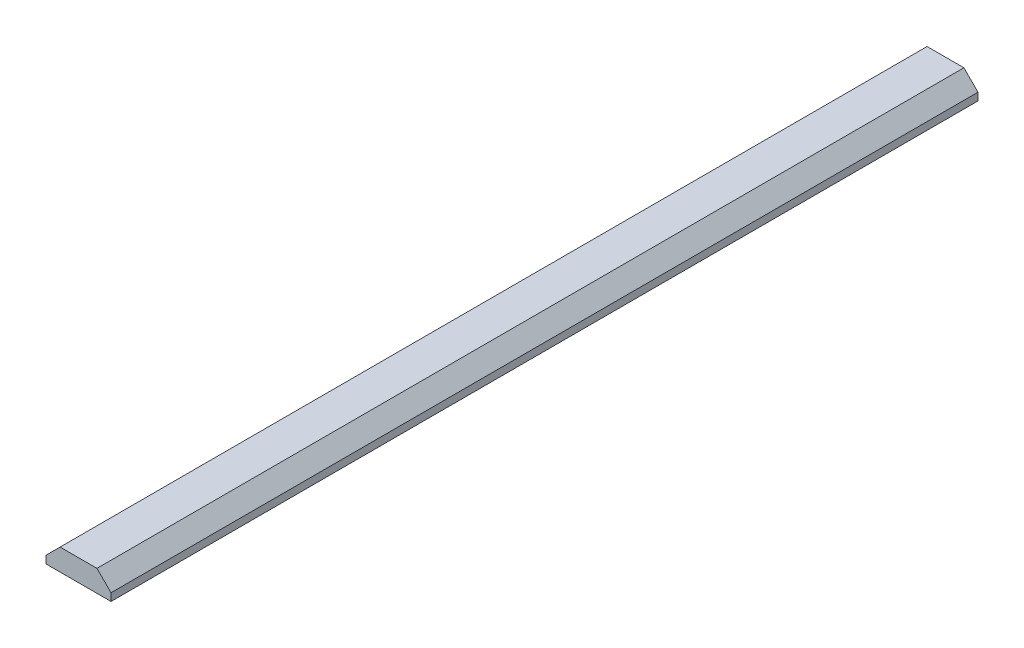
ISO-10303-21;
HEADER;
FILE_DESCRIPTION(('STEP AP214'),'2;1');
FILE_NAME('part.step','',(''),(''),'','','');
FILE_SCHEMA(('AUTOMOTIVE_DESIGN { 1 0 10303 214 1 1 1 1 }'));
ENDSEC;
DATA;
#1=APPLICATION_CONTEXT('core data for automotive mechanical design processes');
#2=APPLICATION_PROTOCOL_DEFINITION('international standard','automotive_design',2000,#1);
#3=PRODUCT_CONTEXT('',#1,'mechanical');
#4=PRODUCT('Part','Part','',(#3));
#5=PRODUCT_RELATED_PRODUCT_CATEGORY('part','',(#4));
#6=PRODUCT_DEFINITION_FORMATION('','',#4);
#7=PRODUCT_DEFINITION_CONTEXT('part definition',#1,'design');
#8=PRODUCT_DEFINITION('design','',#6,#7);
#9=PRODUCT_DEFINITION_SHAPE('','',#8);
#10=(LENGTH_UNIT() NAMED_UNIT(*) SI_UNIT(.MILLI.,.METRE.));
#11=(NAMED_UNIT(*) PLANE_ANGLE_UNIT() SI_UNIT($,.RADIAN.));
#12=(NAMED_UNIT(*) SI_UNIT($,.STERADIAN.) SOLID_ANGLE_UNIT());
#13=UNCERTAINTY_MEASURE_WITH_UNIT(LENGTH_MEASURE(1.E-05),#10,'distance_accuracy_value','');
#14=(GEOMETRIC_REPRESENTATION_CONTEXT(3) GLOBAL_UNCERTAINTY_ASSIGNED_CONTEXT((#13)) GLOBAL_UNIT_ASSIGNED_CONTEXT((#10,
#11,#12)) REPRESENTATION_CONTEXT('',''));
#15=CARTESIAN_POINT('',(0.,0.,0.));
#16=DIRECTION('',(0.,0.,1.));
#17=DIRECTION('',(1.,0.,0.));
#18=AXIS2_PLACEMENT_3D('',#15,#16,#17);
#19=CARTESIAN_POINT('',(3.4,1.80885878693797,160.));
#20=DIRECTION('',(0.707106781186549,0.707106781186546,0.));
#21=DIRECTION('',(-0.707106781186546,0.707106781186549,0.));
#22=AXIS2_PLACEMENT_3D('',#19,#20,#21);
#23=PLANE('',#22);
#24=DIRECTION('',(0.707106781186546,-0.707106781186549,0.));
#25=VECTOR('',#24,1.);
#26=CARTESIAN_POINT('',(3.4,1.80885878693797,0.));
#27=LINE('',#26,#25);
#28=CARTESIAN_POINT('',(3.4,1.80885878693797,0.));
#29=VERTEX_POINT('',#28);
#30=CARTESIAN_POINT('',(6.,-0.791141213062042,0.));
#31=VERTEX_POINT('',#30);
#32=EDGE_CURVE('E127',#29,#31,#27,.T.);
#33=ORIENTED_EDGE('',*,*,#32,.F.);
#34=DIRECTION('',(0.,0.,-1.));
#35=VECTOR('',#34,1.);
#36=CARTESIAN_POINT('',(3.4,1.80885878693797,160.));
#37=LINE('',#36,#35);
#38=CARTESIAN_POINT('',(3.4,1.80885878693797,160.));
#39=VERTEX_POINT('',#38);
#40=EDGE_CURVE('E11',#39,#29,#37,.T.);
#41=ORIENTED_EDGE('',*,*,#40,.F.);
#42=DIRECTION('',(0.707106781186546,-0.707106781186549,0.));
#43=VECTOR('',#42,1.);
#44=CARTESIAN_POINT('',(3.4,1.80885878693797,160.));
#45=LINE('',#44,#43);
#46=CARTESIAN_POINT('',(6.,-0.791141213062042,160.));
#47=VERTEX_POINT('',#46);
#48=EDGE_CURVE('E139',#39,#47,#45,.T.);
#49=ORIENTED_EDGE('',*,*,#48,.T.);
#50=DIRECTION('',(0.,0.,-1.));
#51=VECTOR('',#50,1.);
#52=CARTESIAN_POINT('',(6.,-0.791141213062042,160.));
#53=LINE('',#52,#51);
#54=EDGE_CURVE('E44',#47,#31,#53,.T.);
#55=ORIENTED_EDGE('',*,*,#54,.T.);
#56=EDGE_LOOP('',(#33,#41,#49,#55));
#57=FACE_BOUND('',#56,.T.);
#58=ADVANCED_FACE('F41',(#57),#23,.T.);
#59=CARTESIAN_POINT('',(3.4,1.80885878693797,160.));
#60=DIRECTION('',(0.,-1.,0.));
#61=DIRECTION('',(0.,0.,-1.));
#62=AXIS2_PLACEMENT_3D('',#59,#60,#61);
#63=PLANE('',#62);
#64=DIRECTION('',(-1.,0.,0.));
#65=VECTOR('',#64,1.);
#66=CARTESIAN_POINT('',(3.4,1.80885878693797,0.));
#67=LINE('',#66,#65);
#68=CARTESIAN_POINT('',(-3.4,1.80885878693797,0.));
#69=VERTEX_POINT('',#68);
#70=EDGE_CURVE('E80',#29,#69,#67,.T.);
#71=ORIENTED_EDGE('',*,*,#70,.T.);
#72=DIRECTION('',(0.,0.,-1.));
#73=VECTOR('',#72,1.);
#74=CARTESIAN_POINT('',(-3.4,1.80885878693797,160.));
#75=LINE('',#74,#73);
#76=CARTESIAN_POINT('',(-3.4,1.80885878693797,160.));
#77=VERTEX_POINT('',#76);
#78=EDGE_CURVE('E50',#77,#69,#75,.T.);
#79=ORIENTED_EDGE('',*,*,#78,.F.);
#80=DIRECTION('',(-1.,0.,0.));
#81=VECTOR('',#80,1.);
#82=CARTESIAN_POINT('',(3.4,1.80885878693797,160.));
#83=LINE('',#82,#81);
#84=EDGE_CURVE('E105',#39,#77,#83,.T.);
#85=ORIENTED_EDGE('',*,*,#84,.F.);
#86=ORIENTED_EDGE('',*,*,#40,.T.);
#87=EDGE_LOOP('',(#71,#79,#85,#86));
#88=FACE_BOUND('',#87,.T.);
#89=ADVANCED_FACE('F159',(#88),#63,.F.);
#90=CARTESIAN_POINT('',(-3.4,1.80885878693797,160.));
#91=DIRECTION('',(0.707106781186549,-0.707106781186546,0.));
#92=DIRECTION('',(0.707106781186546,0.707106781186549,0.));
#93=AXIS2_PLACEMENT_3D('',#90,#91,#92);
#94=PLANE('',#93);
#95=DIRECTION('',(-0.707106781186546,-0.707106781186549,0.));
#96=VECTOR('',#95,1.);
#97=CARTESIAN_POINT('',(-3.4,1.80885878693797,0.));
#98=LINE('',#97,#96);
#99=CARTESIAN_POINT('',(-6.,-0.791141213062042,0.));
#100=VERTEX_POINT('',#99);
#101=EDGE_CURVE('E112',#69,#100,#98,.T.);
#102=ORIENTED_EDGE('',*,*,#101,.T.);
#103=DIRECTION('',(0.,0.,-1.));
#104=VECTOR('',#103,1.);
#105=CARTESIAN_POINT('',(-6.,-0.791141213062042,160.));
#106=LINE('',#105,#104);
#107=CARTESIAN_POINT('',(-6.,-0.791141213062042,160.));
#108=VERTEX_POINT('',#107);
#109=EDGE_CURVE('E109',#108,#100,#106,.T.);
#110=ORIENTED_EDGE('',*,*,#109,.F.);
#111=DIRECTION('',(-0.707106781186546,-0.707106781186549,0.));
#112=VECTOR('',#111,1.);
#113=CARTESIAN_POINT('',(-3.4,1.80885878693797,160.));
#114=LINE('',#113,#112);
#115=EDGE_CURVE('E98',#77,#108,#114,.T.);
#116=ORIENTED_EDGE('',*,*,#115,.F.);
#117=ORIENTED_EDGE('',*,*,#78,.T.);
#118=EDGE_LOOP('',(#102,#110,#116,#117));
#119=FACE_BOUND('',#118,.T.);
#120=ADVANCED_FACE('F110',(#119),#94,.F.);
#121=CARTESIAN_POINT('',(-6.,-0.791141213062042,160.));
#122=DIRECTION('',(1.,0.,0.));
#123=DIRECTION('',(0.,0.,-1.));
#124=AXIS2_PLACEMENT_3D('',#121,#122,#123);
#125=PLANE('',#124);
#126=DIRECTION('',(0.,-1.,0.));
#127=VECTOR('',#126,1.);
#128=CARTESIAN_POINT('',(-6.,-0.791141213062042,0.));
#129=LINE('',#128,#127);
#130=CARTESIAN_POINT('',(-6.,-2.19114121306203,0.));
#131=VERTEX_POINT('',#130);
#132=EDGE_CURVE('E136',#100,#131,#129,.T.);
#133=ORIENTED_EDGE('',*,*,#132,.T.);
#134=DIRECTION('',(0.,0.,-1.));
#135=VECTOR('',#134,1.);
#136=CARTESIAN_POINT('',(-6.,-2.19114121306203,160.));
#137=LINE('',#136,#135);
#138=CARTESIAN_POINT('',(-6.,-2.19114121306203,160.));
#139=VERTEX_POINT('',#138);
#140=EDGE_CURVE('E115',#139,#131,#137,.T.);
#141=ORIENTED_EDGE('',*,*,#140,.F.);
#142=DIRECTION('',(0.,-1.,0.));
#143=VECTOR('',#142,1.);
#144=CARTESIAN_POINT('',(-6.,-0.791141213062042,160.));
#145=LINE('',#144,#143);
#146=EDGE_CURVE('E103',#108,#139,#145,.T.);
#147=ORIENTED_EDGE('',*,*,#146,.F.);
#148=ORIENTED_EDGE('',*,*,#109,.T.);
#149=EDGE_LOOP('',(#133,#141,#147,#148));
#150=FACE_BOUND('',#149,.T.);
#151=ADVANCED_FACE('F117',(#150),#125,.F.);
#152=CARTESIAN_POINT('',(-6.,-2.19114121306203,160.));
#153=DIRECTION('',(0.,1.,0.));
#154=DIRECTION('',(0.,0.,1.));
#155=AXIS2_PLACEMENT_3D('',#152,#153,#154);
#156=PLANE('',#155);
#157=DIRECTION('',(1.,0.,0.));
#158=VECTOR('',#157,1.);
#159=CARTESIAN_POINT('',(-6.,-2.19114121306203,0.));
#160=LINE('',#159,#158);
#161=CARTESIAN_POINT('',(6.,-2.19114121306203,0.));
#162=VERTEX_POINT('',#161);
#163=EDGE_CURVE('E133',#131,#162,#160,.T.);
#164=ORIENTED_EDGE('',*,*,#163,.T.);
#165=DIRECTION('',(0.,0.,-1.));
#166=VECTOR('',#165,1.);
#167=CARTESIAN_POINT('',(6.,-2.19114121306203,160.));
#168=LINE('',#167,#166);
#169=CARTESIAN_POINT('',(6.,-2.19114121306203,160.));
#170=VERTEX_POINT('',#169);
#171=EDGE_CURVE('E142',#170,#162,#168,.T.);
#172=ORIENTED_EDGE('',*,*,#171,.F.);
#173=DIRECTION('',(1.,0.,0.));
#174=VECTOR('',#173,1.);
#175=CARTESIAN_POINT('',(-6.,-2.19114121306203,160.));
#176=LINE('',#175,#174);
#177=EDGE_CURVE('E120',#139,#170,#176,.T.);
#178=ORIENTED_EDGE('',*,*,#177,.F.);
#179=ORIENTED_EDGE('',*,*,#140,.T.);
#180=EDGE_LOOP('',(#164,#172,#178,#179));
#181=FACE_BOUND('',#180,.T.);
#182=ADVANCED_FACE('F149',(#181),#156,.F.);
#183=CARTESIAN_POINT('',(6.,-0.791141213062042,160.));
#184=DIRECTION('',(1.,0.,0.));
#185=DIRECTION('',(0.,0.,-1.));
#186=AXIS2_PLACEMENT_3D('',#183,#184,#185);
#187=PLANE('',#186);
#188=DIRECTION('',(0.,-1.,0.));
#189=VECTOR('',#188,1.);
#190=CARTESIAN_POINT('',(6.,-0.791141213062042,0.));
#191=LINE('',#190,#189);
#192=EDGE_CURVE('E130',#31,#162,#191,.T.);
#193=ORIENTED_EDGE('',*,*,#192,.F.);
#194=ORIENTED_EDGE('',*,*,#54,.F.);
#195=DIRECTION('',(0.,-1.,0.));
#196=VECTOR('',#195,1.);
#197=CARTESIAN_POINT('',(6.,-0.791141213062042,160.));
#198=LINE('',#197,#196);
#199=EDGE_CURVE('E122',#47,#170,#198,.T.);
#200=ORIENTED_EDGE('',*,*,#199,.T.);
#201=ORIENTED_EDGE('',*,*,#171,.T.);
#202=EDGE_LOOP('',(#193,#194,#200,#201));
#203=FACE_BOUND('',#202,.T.);
#204=ADVANCED_FACE('F144',(#203),#187,.T.);
#205=CARTESIAN_POINT('',(0.,0.,160.));
#206=DIRECTION('',(0.,0.,-1.));
#207=DIRECTION('',(-1.,0.,0.));
#208=AXIS2_PLACEMENT_3D('',#205,#206,#207);
#209=PLANE('',#208);
#210=ORIENTED_EDGE('',*,*,#48,.F.);
#211=ORIENTED_EDGE('',*,*,#84,.T.);
#212=ORIENTED_EDGE('',*,*,#115,.T.);
#213=ORIENTED_EDGE('',*,*,#146,.T.);
#214=ORIENTED_EDGE('',*,*,#177,.T.);
#215=ORIENTED_EDGE('',*,*,#199,.F.);
#216=EDGE_LOOP('',(#210,#211,#212,#213,#214,#215));
#217=FACE_BOUND('',#216,.T.);
#218=ADVANCED_FACE('F101',(#217),#209,.F.);
#219=CARTESIAN_POINT('',(0.,0.,0.));
#220=DIRECTION('',(0.,0.,-1.));
#221=DIRECTION('',(-1.,0.,0.));
#222=AXIS2_PLACEMENT_3D('',#219,#220,#221);
#223=PLANE('',#222);
#224=ORIENTED_EDGE('',*,*,#32,.T.);
#225=ORIENTED_EDGE('',*,*,#192,.T.);
#226=ORIENTED_EDGE('',*,*,#163,.F.);
#227=ORIENTED_EDGE('',*,*,#132,.F.);
#228=ORIENTED_EDGE('',*,*,#101,.F.);
#229=ORIENTED_EDGE('',*,*,#70,.F.);
#230=EDGE_LOOP('',(#224,#225,#226,#227,#228,#229));
#231=FACE_BOUND('',#230,.T.);
#232=ADVANCED_FACE('F147',(#231),#223,.T.);
#233=CLOSED_SHELL('',(#58,#89,#120,#151,#182,#204,#218,#232));
#234=MANIFOLD_SOLID_BREP('B2',#233);
#235=ADVANCED_BREP_SHAPE_REPRESENTATION('',(#18,#234),#14);
#236=SHAPE_DEFINITION_REPRESENTATION(#9,#235);
ENDSEC;
END-ISO-10303-21;
